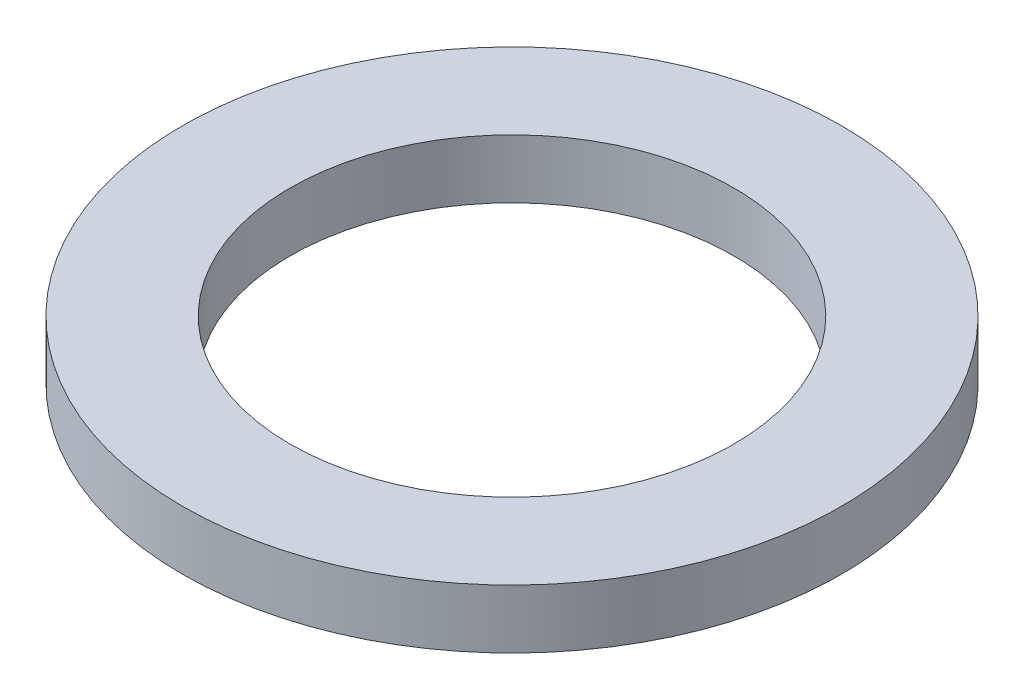
ISO-10303-21;
HEADER;
FILE_DESCRIPTION(('STEP AP214'),'2;1');
FILE_NAME('part.step','',(''),(''),'','','');
FILE_SCHEMA(('AUTOMOTIVE_DESIGN { 1 0 10303 214 1 1 1 1 }'));
ENDSEC;
DATA;
#1=APPLICATION_CONTEXT('core data for automotive mechanical design processes');
#2=APPLICATION_PROTOCOL_DEFINITION('international standard','automotive_design',2000,#1);
#3=PRODUCT_CONTEXT('',#1,'mechanical');
#4=PRODUCT('Part','Part','',(#3));
#5=PRODUCT_RELATED_PRODUCT_CATEGORY('part','',(#4));
#6=PRODUCT_DEFINITION_FORMATION('','',#4);
#7=PRODUCT_DEFINITION_CONTEXT('part definition',#1,'design');
#8=PRODUCT_DEFINITION('design','',#6,#7);
#9=PRODUCT_DEFINITION_SHAPE('','',#8);
#10=(LENGTH_UNIT() NAMED_UNIT(*) SI_UNIT(.MILLI.,.METRE.));
#11=(NAMED_UNIT(*) PLANE_ANGLE_UNIT() SI_UNIT($,.RADIAN.));
#12=(NAMED_UNIT(*) SI_UNIT($,.STERADIAN.) SOLID_ANGLE_UNIT());
#13=UNCERTAINTY_MEASURE_WITH_UNIT(LENGTH_MEASURE(1.E-05),#10,'distance_accuracy_value','');
#14=(GEOMETRIC_REPRESENTATION_CONTEXT(3) GLOBAL_UNCERTAINTY_ASSIGNED_CONTEXT((#13)) GLOBAL_UNIT_ASSIGNED_CONTEXT((#10,
#11,#12)) REPRESENTATION_CONTEXT('',''));
#15=CARTESIAN_POINT('',(0.,0.,0.));
#16=DIRECTION('',(0.,0.,1.));
#17=DIRECTION('',(1.,0.,0.));
#18=AXIS2_PLACEMENT_3D('',#15,#16,#17);
#19=CARTESIAN_POINT('',(0.,1.7018,0.));
#20=DIRECTION('',(0.,1.,0.));
#21=DIRECTION('',(0.,0.,1.));
#22=AXIS2_PLACEMENT_3D('',#19,#20,#21);
#23=PLANE('',#22);
#24=CARTESIAN_POINT('',(0.,1.7018,0.));
#25=DIRECTION('',(0.,1.,0.));
#26=DIRECTION('',(0.,0.,1.));
#27=AXIS2_PLACEMENT_3D('',#24,#25,#26);
#28=CIRCLE('',#27,9.525);
#29=CARTESIAN_POINT('',(0.,1.7018,9.525));
#30=VERTEX_POINT('',#29);
#31=EDGE_CURVE('E10',#30,#30,#28,.T.);
#32=ORIENTED_EDGE('',*,*,#31,.T.);
#33=EDGE_LOOP('',(#32));
#34=FACE_BOUND('',#33,.T.);
#35=CARTESIAN_POINT('',(0.,1.7018,0.));
#36=DIRECTION('',(0.,1.,0.));
#37=DIRECTION('',(0.,0.,1.));
#38=AXIS2_PLACEMENT_3D('',#35,#36,#37);
#39=CIRCLE('',#38,6.4135);
#40=CARTESIAN_POINT('',(0.,1.7018,6.4135));
#41=VERTEX_POINT('',#40);
#42=EDGE_CURVE('E52',#41,#41,#39,.T.);
#43=ORIENTED_EDGE('',*,*,#42,.F.);
#44=EDGE_LOOP('',(#43));
#45=FACE_BOUND('',#44,.T.);
#46=ADVANCED_FACE('F39',(#34,#45),#23,.T.);
#47=CARTESIAN_POINT('',(0.,0.,0.));
#48=DIRECTION('',(0.,1.,0.));
#49=DIRECTION('',(0.,0.,1.));
#50=AXIS2_PLACEMENT_3D('',#47,#48,#49);
#51=PLANE('',#50);
#52=CARTESIAN_POINT('',(0.,0.,0.));
#53=DIRECTION('',(0.,1.,0.));
#54=DIRECTION('',(0.,0.,1.));
#55=AXIS2_PLACEMENT_3D('',#52,#53,#54);
#56=CIRCLE('',#55,9.525);
#57=CARTESIAN_POINT('',(0.,0.,9.525));
#58=VERTEX_POINT('',#57);
#59=EDGE_CURVE('E43',#58,#58,#56,.T.);
#60=ORIENTED_EDGE('',*,*,#59,.F.);
#61=EDGE_LOOP('',(#60));
#62=FACE_BOUND('',#61,.T.);
#63=CARTESIAN_POINT('',(0.,0.,0.));
#64=DIRECTION('',(0.,1.,0.));
#65=DIRECTION('',(0.,0.,1.));
#66=AXIS2_PLACEMENT_3D('',#63,#64,#65);
#67=CIRCLE('',#66,6.4135);
#68=CARTESIAN_POINT('',(0.,0.,6.4135));
#69=VERTEX_POINT('',#68);
#70=EDGE_CURVE('E54',#69,#69,#67,.T.);
#71=ORIENTED_EDGE('',*,*,#70,.T.);
#72=EDGE_LOOP('',(#71));
#73=FACE_BOUND('',#72,.T.);
#74=ADVANCED_FACE('F66',(#62,#73),#51,.F.);
#75=CARTESIAN_POINT('',(0.,1.7018,0.));
#76=DIRECTION('',(0.,-1.,0.));
#77=DIRECTION('',(0.,0.,-1.));
#78=AXIS2_PLACEMENT_3D('',#75,#76,#77);
#79=CYLINDRICAL_SURFACE('',#78,9.525);
#80=ORIENTED_EDGE('',*,*,#31,.F.);
#81=EDGE_LOOP('',(#80));
#82=FACE_BOUND('',#81,.T.);
#83=ORIENTED_EDGE('',*,*,#59,.T.);
#84=EDGE_LOOP('',(#83));
#85=FACE_BOUND('',#84,.T.);
#86=ADVANCED_FACE('F41',(#82,#85),#79,.T.);
#87=CARTESIAN_POINT('',(0.,1.7018,0.));
#88=DIRECTION('',(0.,-1.,0.));
#89=DIRECTION('',(0.,0.,-1.));
#90=AXIS2_PLACEMENT_3D('',#87,#88,#89);
#91=CYLINDRICAL_SURFACE('',#90,6.4135);
#92=ORIENTED_EDGE('',*,*,#42,.T.);
#93=EDGE_LOOP('',(#92));
#94=FACE_BOUND('',#93,.T.);
#95=ORIENTED_EDGE('',*,*,#70,.F.);
#96=EDGE_LOOP('',(#95));
#97=FACE_BOUND('',#96,.T.);
#98=ADVANCED_FACE('F62',(#94,#97),#91,.F.);
#99=CLOSED_SHELL('',(#46,#74,#86,#98));
#100=MANIFOLD_SOLID_BREP('B2',#99);
#101=ADVANCED_BREP_SHAPE_REPRESENTATION('',(#18,#100),#14);
#102=SHAPE_DEFINITION_REPRESENTATION(#9,#101);
ENDSEC;
END-ISO-10303-21;
